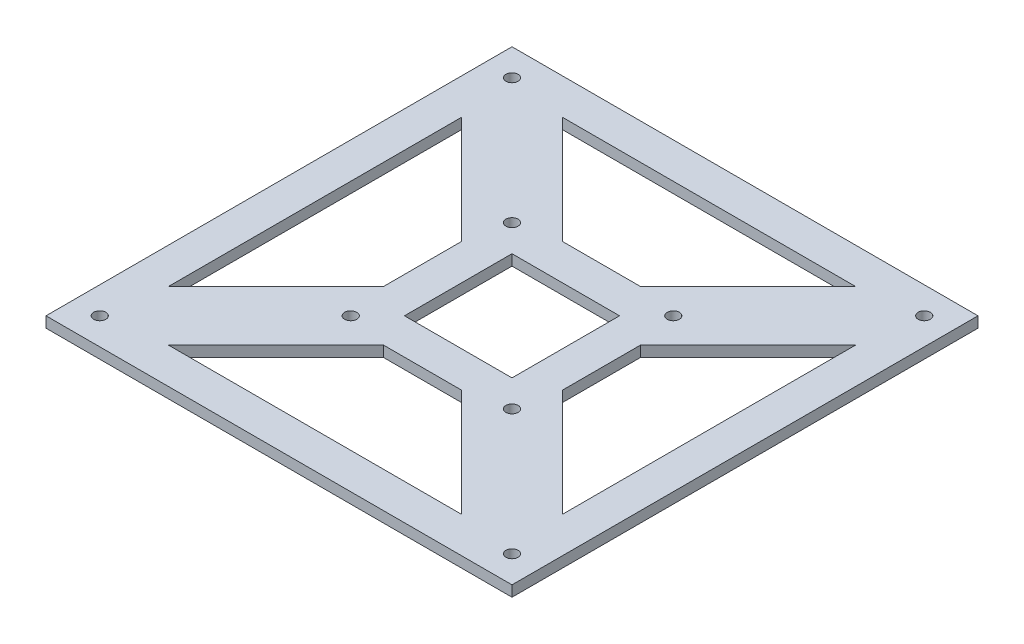
ISO-10303-21;
HEADER;
FILE_DESCRIPTION(('STEP AP214'),'2;1');
FILE_NAME('part.step','',(''),(''),'','','');
FILE_SCHEMA(('AUTOMOTIVE_DESIGN { 1 0 10303 214 1 1 1 1 }'));
ENDSEC;
DATA;
#1=APPLICATION_CONTEXT('core data for automotive mechanical design processes');
#2=APPLICATION_PROTOCOL_DEFINITION('international standard','automotive_design',2000,#1);
#3=PRODUCT_CONTEXT('',#1,'mechanical');
#4=PRODUCT('Part','Part','',(#3));
#5=PRODUCT_RELATED_PRODUCT_CATEGORY('part','',(#4));
#6=PRODUCT_DEFINITION_FORMATION('','',#4);
#7=PRODUCT_DEFINITION_CONTEXT('part definition',#1,'design');
#8=PRODUCT_DEFINITION('design','',#6,#7);
#9=PRODUCT_DEFINITION_SHAPE('','',#8);
#10=(LENGTH_UNIT() NAMED_UNIT(*) SI_UNIT(.MILLI.,.METRE.));
#11=(NAMED_UNIT(*) PLANE_ANGLE_UNIT() SI_UNIT($,.RADIAN.));
#12=(NAMED_UNIT(*) SI_UNIT($,.STERADIAN.) SOLID_ANGLE_UNIT());
#13=UNCERTAINTY_MEASURE_WITH_UNIT(LENGTH_MEASURE(1.E-05),#10,'distance_accuracy_value','');
#14=(GEOMETRIC_REPRESENTATION_CONTEXT(3) GLOBAL_UNCERTAINTY_ASSIGNED_CONTEXT((#13)) GLOBAL_UNIT_ASSIGNED_CONTEXT((#10,
#11,#12)) REPRESENTATION_CONTEXT('',''));
#15=CARTESIAN_POINT('',(0.,0.,0.));
#16=DIRECTION('',(0.,0.,1.));
#17=DIRECTION('',(1.,0.,0.));
#18=AXIS2_PLACEMENT_3D('',#15,#16,#17);
#19=CARTESIAN_POINT('',(0.,3.,-65.));
#20=DIRECTION('',(0.,0.,-1.));
#21=DIRECTION('',(-1.,0.,0.));
#22=AXIS2_PLACEMENT_3D('',#19,#20,#21);
#23=PLANE('',#22);
#24=DIRECTION('',(1.,0.,0.));
#25=VECTOR('',#24,1.);
#26=CARTESIAN_POINT('',(0.,0.,-65.));
#27=LINE('',#26,#25);
#28=CARTESIAN_POINT('',(-65.,0.,-65.));
#29=VERTEX_POINT('',#28);
#30=CARTESIAN_POINT('',(65.,0.,-65.));
#31=VERTEX_POINT('',#30);
#32=EDGE_CURVE('E383',#29,#31,#27,.T.);
#33=ORIENTED_EDGE('',*,*,#32,.F.);
#34=DIRECTION('',(0.,-1.,0.));
#35=VECTOR('',#34,1.);
#36=CARTESIAN_POINT('',(-65.,3.,-65.));
#37=LINE('',#36,#35);
#38=CARTESIAN_POINT('',(-65.,3.,-65.));
#39=VERTEX_POINT('',#38);
#40=EDGE_CURVE('E127',#39,#29,#37,.T.);
#41=ORIENTED_EDGE('',*,*,#40,.F.);
#42=DIRECTION('',(1.,0.,0.));
#43=VECTOR('',#42,1.);
#44=CARTESIAN_POINT('',(0.,3.,-65.));
#45=LINE('',#44,#43);
#46=CARTESIAN_POINT('',(65.,3.,-65.));
#47=VERTEX_POINT('',#46);
#48=EDGE_CURVE('E512',#39,#47,#45,.T.);
#49=ORIENTED_EDGE('',*,*,#48,.T.);
#50=DIRECTION('',(0.,-1.,0.));
#51=VECTOR('',#50,1.);
#52=CARTESIAN_POINT('',(65.,3.,-65.));
#53=LINE('',#52,#51);
#54=EDGE_CURVE('E12',#47,#31,#53,.T.);
#55=ORIENTED_EDGE('',*,*,#54,.T.);
#56=EDGE_LOOP('',(#33,#41,#49,#55));
#57=FACE_BOUND('',#56,.T.);
#58=ADVANCED_FACE('F116',(#57),#23,.T.);
#59=CARTESIAN_POINT('',(-65.,3.,0.));
#60=DIRECTION('',(1.,0.,0.));
#61=DIRECTION('',(0.,0.,-1.));
#62=AXIS2_PLACEMENT_3D('',#59,#60,#61);
#63=PLANE('',#62);
#64=DIRECTION('',(0.,0.,1.));
#65=VECTOR('',#64,1.);
#66=CARTESIAN_POINT('',(-65.,0.,0.));
#67=LINE('',#66,#65);
#68=CARTESIAN_POINT('',(-65.,0.,65.));
#69=VERTEX_POINT('',#68);
#70=EDGE_CURVE('E387',#29,#69,#67,.T.);
#71=ORIENTED_EDGE('',*,*,#70,.T.);
#72=DIRECTION('',(0.,-1.,0.));
#73=VECTOR('',#72,1.);
#74=CARTESIAN_POINT('',(-65.,3.,65.));
#75=LINE('',#74,#73);
#76=CARTESIAN_POINT('',(-65.,3.,65.));
#77=VERTEX_POINT('',#76);
#78=EDGE_CURVE('E399',#77,#69,#75,.T.);
#79=ORIENTED_EDGE('',*,*,#78,.F.);
#80=DIRECTION('',(0.,0.,1.));
#81=VECTOR('',#80,1.);
#82=CARTESIAN_POINT('',(-65.,3.,0.));
#83=LINE('',#82,#81);
#84=EDGE_CURVE('E515',#39,#77,#83,.T.);
#85=ORIENTED_EDGE('',*,*,#84,.F.);
#86=ORIENTED_EDGE('',*,*,#40,.T.);
#87=EDGE_LOOP('',(#71,#79,#85,#86));
#88=FACE_BOUND('',#87,.T.);
#89=ADVANCED_FACE('F522',(#88),#63,.F.);
#90=CARTESIAN_POINT('',(0.,3.,65.));
#91=DIRECTION('',(0.,0.,-1.));
#92=DIRECTION('',(-1.,0.,0.));
#93=AXIS2_PLACEMENT_3D('',#90,#91,#92);
#94=PLANE('',#93);
#95=DIRECTION('',(1.,0.,0.));
#96=VECTOR('',#95,1.);
#97=CARTESIAN_POINT('',(0.,0.,65.));
#98=LINE('',#97,#96);
#99=CARTESIAN_POINT('',(65.,0.,65.));
#100=VERTEX_POINT('',#99);
#101=EDGE_CURVE('E391',#69,#100,#98,.T.);
#102=ORIENTED_EDGE('',*,*,#101,.T.);
#103=DIRECTION('',(0.,-1.,0.));
#104=VECTOR('',#103,1.);
#105=CARTESIAN_POINT('',(65.,3.,65.));
#106=LINE('',#105,#104);
#107=CARTESIAN_POINT('',(65.,3.,65.));
#108=VERTEX_POINT('',#107);
#109=EDGE_CURVE('E396',#108,#100,#106,.T.);
#110=ORIENTED_EDGE('',*,*,#109,.F.);
#111=DIRECTION('',(1.,0.,0.));
#112=VECTOR('',#111,1.);
#113=CARTESIAN_POINT('',(0.,3.,65.));
#114=LINE('',#113,#112);
#115=EDGE_CURVE('E136',#77,#108,#114,.T.);
#116=ORIENTED_EDGE('',*,*,#115,.F.);
#117=ORIENTED_EDGE('',*,*,#78,.T.);
#118=EDGE_LOOP('',(#102,#110,#116,#117));
#119=FACE_BOUND('',#118,.T.);
#120=ADVANCED_FACE('F525',(#119),#94,.F.);
#121=CARTESIAN_POINT('',(65.,3.,0.));
#122=DIRECTION('',(1.,0.,0.));
#123=DIRECTION('',(0.,0.,-1.));
#124=AXIS2_PLACEMENT_3D('',#121,#122,#123);
#125=PLANE('',#124);
#126=DIRECTION('',(0.,0.,1.));
#127=VECTOR('',#126,1.);
#128=CARTESIAN_POINT('',(65.,0.,0.));
#129=LINE('',#128,#127);
#130=EDGE_CURVE('E379',#31,#100,#129,.T.);
#131=ORIENTED_EDGE('',*,*,#130,.F.);
#132=ORIENTED_EDGE('',*,*,#54,.F.);
#133=DIRECTION('',(0.,0.,1.));
#134=VECTOR('',#133,1.);
#135=CARTESIAN_POINT('',(65.,3.,0.));
#136=LINE('',#135,#134);
#137=EDGE_CURVE('E508',#47,#108,#136,.T.);
#138=ORIENTED_EDGE('',*,*,#137,.T.);
#139=ORIENTED_EDGE('',*,*,#109,.T.);
#140=EDGE_LOOP('',(#131,#132,#138,#139));
#141=FACE_BOUND('',#140,.T.);
#142=ADVANCED_FACE('F529',(#141),#125,.T.);
#143=CARTESIAN_POINT('',(-7.07106781186545,3.,-7.07106781186545));
#144=DIRECTION('',(-0.707106781186547,0.,-0.707106781186548));
#145=DIRECTION('',(-0.707106781186548,0.,0.707106781186547));
#146=AXIS2_PLACEMENT_3D('',#143,#144,#145);
#147=PLANE('',#146);
#148=DIRECTION('',(0.707106781186548,0.,-0.707106781186547));
#149=VECTOR('',#148,1.);
#150=CARTESIAN_POINT('',(-7.07106781186545,0.,-7.07106781186545));
#151=LINE('',#150,#149);
#152=CARTESIAN_POINT('',(-55.,0.,40.8578643762691));
#153=VERTEX_POINT('',#152);
#154=CARTESIAN_POINT('',(-25.,0.,10.8578643762691));
#155=VERTEX_POINT('',#154);
#156=EDGE_CURVE('E300',#153,#155,#151,.T.);
#157=ORIENTED_EDGE('',*,*,#156,.F.);
#158=DIRECTION('',(0.,-1.,0.));
#159=VECTOR('',#158,1.);
#160=CARTESIAN_POINT('',(-55.,3.,40.8578643762691));
#161=LINE('',#160,#159);
#162=CARTESIAN_POINT('',(-55.,3.,40.8578643762691));
#163=VERTEX_POINT('',#162);
#164=EDGE_CURVE('E448',#163,#153,#161,.T.);
#165=ORIENTED_EDGE('',*,*,#164,.F.);
#166=DIRECTION('',(0.707106781186548,0.,-0.707106781186547));
#167=VECTOR('',#166,1.);
#168=CARTESIAN_POINT('',(-7.07106781186545,3.,-7.07106781186545));
#169=LINE('',#168,#167);
#170=CARTESIAN_POINT('',(-25.,3.,10.8578643762691));
#171=VERTEX_POINT('',#170);
#172=EDGE_CURVE('E395',#163,#171,#169,.T.);
#173=ORIENTED_EDGE('',*,*,#172,.T.);
#174=DIRECTION('',(0.,-1.,0.));
#175=VECTOR('',#174,1.);
#176=CARTESIAN_POINT('',(-25.,3.,10.8578643762691));
#177=LINE('',#176,#175);
#178=EDGE_CURVE('E322',#171,#155,#177,.T.);
#179=ORIENTED_EDGE('',*,*,#178,.T.);
#180=EDGE_LOOP('',(#157,#165,#173,#179));
#181=FACE_BOUND('',#180,.T.);
#182=ADVANCED_FACE('F452',(#181),#147,.T.);
#183=CARTESIAN_POINT('',(-55.,3.,0.));
#184=DIRECTION('',(1.,0.,0.));
#185=DIRECTION('',(0.,0.,-1.));
#186=AXIS2_PLACEMENT_3D('',#183,#184,#185);
#187=PLANE('',#186);
#188=DIRECTION('',(0.,0.,1.));
#189=VECTOR('',#188,1.);
#190=CARTESIAN_POINT('',(-55.,0.,0.));
#191=LINE('',#190,#189);
#192=CARTESIAN_POINT('',(-55.,0.,-40.8578643762769));
#193=VERTEX_POINT('',#192);
#194=EDGE_CURVE('E333',#193,#153,#191,.T.);
#195=ORIENTED_EDGE('',*,*,#194,.F.);
#196=DIRECTION('',(0.,-1.,0.));
#197=VECTOR('',#196,1.);
#198=CARTESIAN_POINT('',(-55.,3.,-40.8578643762769));
#199=LINE('',#198,#197);
#200=CARTESIAN_POINT('',(-55.,3.,-40.8578643762769));
#201=VERTEX_POINT('',#200);
#202=EDGE_CURVE('E445',#201,#193,#199,.T.);
#203=ORIENTED_EDGE('',*,*,#202,.F.);
#204=DIRECTION('',(0.,0.,1.));
#205=VECTOR('',#204,1.);
#206=CARTESIAN_POINT('',(-55.,3.,0.));
#207=LINE('',#206,#205);
#208=EDGE_CURVE('E460',#201,#163,#207,.T.);
#209=ORIENTED_EDGE('',*,*,#208,.T.);
#210=ORIENTED_EDGE('',*,*,#164,.T.);
#211=EDGE_LOOP('',(#195,#203,#209,#210));
#212=FACE_BOUND('',#211,.T.);
#213=ADVANCED_FACE('F660',(#212),#187,.T.);
#214=CARTESIAN_POINT('',(-7.07106781186158,3.,7.07106781186158));
#215=DIRECTION('',(0.707106781186547,0.,-0.707106781186547));
#216=DIRECTION('',(-0.707106781186548,0.,-0.707106781186548));
#217=AXIS2_PLACEMENT_3D('',#214,#215,#216);
#218=PLANE('',#217);
#219=DIRECTION('',(0.707106781186548,0.,0.707106781186548));
#220=VECTOR('',#219,1.);
#221=CARTESIAN_POINT('',(-7.07106781186158,0.,7.07106781186158));
#222=LINE('',#221,#220);
#223=CARTESIAN_POINT('',(-25.,0.,-10.8578643762768));
#224=VERTEX_POINT('',#223);
#225=EDGE_CURVE('E339',#193,#224,#222,.T.);
#226=ORIENTED_EDGE('',*,*,#225,.T.);
#227=DIRECTION('',(0.,-1.,0.));
#228=VECTOR('',#227,1.);
#229=CARTESIAN_POINT('',(-25.,3.,-10.8578643762768));
#230=LINE('',#229,#228);
#231=CARTESIAN_POINT('',(-25.,3.,-10.8578643762768));
#232=VERTEX_POINT('',#231);
#233=EDGE_CURVE('E324',#232,#224,#230,.T.);
#234=ORIENTED_EDGE('',*,*,#233,.F.);
#235=DIRECTION('',(0.707106781186548,0.,0.707106781186548));
#236=VECTOR('',#235,1.);
#237=CARTESIAN_POINT('',(-7.07106781186158,3.,7.07106781186158));
#238=LINE('',#237,#236);
#239=EDGE_CURVE('E463',#201,#232,#238,.T.);
#240=ORIENTED_EDGE('',*,*,#239,.F.);
#241=ORIENTED_EDGE('',*,*,#202,.T.);
#242=EDGE_LOOP('',(#226,#234,#240,#241));
#243=FACE_BOUND('',#242,.T.);
#244=ADVANCED_FACE('F656',(#243),#218,.F.);
#245=CARTESIAN_POINT('',(7.07106781186937,3.,-7.07106781186937));
#246=DIRECTION('',(0.707106781186547,0.,-0.707106781186548));
#247=DIRECTION('',(-0.707106781186548,0.,-0.707106781186547));
#248=AXIS2_PLACEMENT_3D('',#245,#246,#247);
#249=PLANE('',#248);
#250=DIRECTION('',(0.707106781186548,0.,0.707106781186547));
#251=VECTOR('',#250,1.);
#252=CARTESIAN_POINT('',(7.07106781186937,0.,-7.07106781186937));
#253=LINE('',#252,#251);
#254=CARTESIAN_POINT('',(-40.8578643762613,0.,-55.));
#255=VERTEX_POINT('',#254);
#256=CARTESIAN_POINT('',(-10.8578643762612,0.,-25.));
#257=VERTEX_POINT('',#256);
#258=EDGE_CURVE('E346',#255,#257,#253,.T.);
#259=ORIENTED_EDGE('',*,*,#258,.F.);
#260=DIRECTION('',(0.,-1.,0.));
#261=VECTOR('',#260,1.);
#262=CARTESIAN_POINT('',(-40.8578643762613,3.,-55.));
#263=LINE('',#262,#261);
#264=CARTESIAN_POINT('',(-40.8578643762613,3.,-55.));
#265=VERTEX_POINT('',#264);
#266=EDGE_CURVE('E437',#265,#255,#263,.T.);
#267=ORIENTED_EDGE('',*,*,#266,.F.);
#268=DIRECTION('',(0.707106781186548,0.,0.707106781186547));
#269=VECTOR('',#268,1.);
#270=CARTESIAN_POINT('',(7.07106781186937,3.,-7.07106781186937));
#271=LINE('',#270,#269);
#272=CARTESIAN_POINT('',(-10.8578643762612,3.,-25.));
#273=VERTEX_POINT('',#272);
#274=EDGE_CURVE('E472',#265,#273,#271,.T.);
#275=ORIENTED_EDGE('',*,*,#274,.T.);
#276=DIRECTION('',(0.,-1.,0.));
#277=VECTOR('',#276,1.);
#278=CARTESIAN_POINT('',(-10.8578643762612,3.,-25.));
#279=LINE('',#278,#277);
#280=EDGE_CURVE('E440',#273,#257,#279,.T.);
#281=ORIENTED_EDGE('',*,*,#280,.T.);
#282=EDGE_LOOP('',(#259,#267,#275,#281));
#283=FACE_BOUND('',#282,.T.);
#284=ADVANCED_FACE('F652',(#283),#249,.T.);
#285=CARTESIAN_POINT('',(0.,3.,-55.));
#286=DIRECTION('',(0.,0.,-1.));
#287=DIRECTION('',(-1.,0.,0.));
#288=AXIS2_PLACEMENT_3D('',#285,#286,#287);
#289=PLANE('',#288);
#290=DIRECTION('',(1.,0.,0.));
#291=VECTOR('',#290,1.);
#292=CARTESIAN_POINT('',(0.,0.,-55.));
#293=LINE('',#292,#291);
#294=CARTESIAN_POINT('',(40.8578643762691,0.,-55.));
#295=VERTEX_POINT('',#294);
#296=EDGE_CURVE('E350',#255,#295,#293,.T.);
#297=ORIENTED_EDGE('',*,*,#296,.T.);
#298=DIRECTION('',(0.,-1.,0.));
#299=VECTOR('',#298,1.);
#300=CARTESIAN_POINT('',(40.8578643762691,3.,-55.));
#301=LINE('',#300,#299);
#302=CARTESIAN_POINT('',(40.8578643762691,3.,-55.));
#303=VERTEX_POINT('',#302);
#304=EDGE_CURVE('E433',#303,#295,#301,.T.);
#305=ORIENTED_EDGE('',*,*,#304,.F.);
#306=DIRECTION('',(1.,0.,0.));
#307=VECTOR('',#306,1.);
#308=CARTESIAN_POINT('',(0.,3.,-55.));
#309=LINE('',#308,#307);
#310=EDGE_CURVE('E476',#265,#303,#309,.T.);
#311=ORIENTED_EDGE('',*,*,#310,.F.);
#312=ORIENTED_EDGE('',*,*,#266,.T.);
#313=EDGE_LOOP('',(#297,#305,#311,#312));
#314=FACE_BOUND('',#313,.T.);
#315=ADVANCED_FACE('F648',(#314),#289,.F.);
#316=CARTESIAN_POINT('',(-7.07106781186544,3.,-7.07106781186544));
#317=DIRECTION('',(0.707106781186548,0.,0.707106781186547));
#318=DIRECTION('',(0.707106781186547,0.,-0.707106781186548));
#319=AXIS2_PLACEMENT_3D('',#316,#317,#318);
#320=PLANE('',#319);
#321=DIRECTION('',(-0.707106781186547,0.,0.707106781186548));
#322=VECTOR('',#321,1.);
#323=CARTESIAN_POINT('',(-7.07106781186544,0.,-7.07106781186544));
#324=LINE('',#323,#322);
#325=CARTESIAN_POINT('',(10.8578643762691,0.,-25.));
#326=VERTEX_POINT('',#325);
#327=EDGE_CURVE('E353',#295,#326,#324,.T.);
#328=ORIENTED_EDGE('',*,*,#327,.T.);
#329=DIRECTION('',(0.,-1.,0.));
#330=VECTOR('',#329,1.);
#331=CARTESIAN_POINT('',(10.8578643762691,3.,-25.));
#332=LINE('',#331,#330);
#333=CARTESIAN_POINT('',(10.8578643762691,3.,-25.));
#334=VERTEX_POINT('',#333);
#335=EDGE_CURVE('E430',#334,#326,#332,.T.);
#336=ORIENTED_EDGE('',*,*,#335,.F.);
#337=DIRECTION('',(-0.707106781186547,0.,0.707106781186548));
#338=VECTOR('',#337,1.);
#339=CARTESIAN_POINT('',(-7.07106781186544,3.,-7.07106781186544));
#340=LINE('',#339,#338);
#341=EDGE_CURVE('E480',#303,#334,#340,.T.);
#342=ORIENTED_EDGE('',*,*,#341,.F.);
#343=ORIENTED_EDGE('',*,*,#304,.T.);
#344=EDGE_LOOP('',(#328,#336,#342,#343));
#345=FACE_BOUND('',#344,.T.);
#346=ADVANCED_FACE('F645',(#345),#320,.F.);
#347=CARTESIAN_POINT('',(7.0710678118655,3.,7.0710678118655));
#348=DIRECTION('',(0.707106781186548,0.,0.707106781186547));
#349=DIRECTION('',(0.707106781186547,0.,-0.707106781186548));
#350=AXIS2_PLACEMENT_3D('',#347,#348,#349);
#351=PLANE('',#350);
#352=DIRECTION('',(-0.707106781186547,0.,0.707106781186548));
#353=VECTOR('',#352,1.);
#354=CARTESIAN_POINT('',(7.0710678118655,0.,7.0710678118655));
#355=LINE('',#354,#353);
#356=CARTESIAN_POINT('',(55.,0.,-40.857864376269));
#357=VERTEX_POINT('',#356);
#358=CARTESIAN_POINT('',(25.,0.,-10.857864376269));
#359=VERTEX_POINT('',#358);
#360=EDGE_CURVE('E357',#357,#359,#355,.T.);
#361=ORIENTED_EDGE('',*,*,#360,.F.);
#362=DIRECTION('',(0.,-1.,0.));
#363=VECTOR('',#362,1.);
#364=CARTESIAN_POINT('',(55.,3.,-40.857864376269));
#365=LINE('',#364,#363);
#366=CARTESIAN_POINT('',(55.,3.,-40.857864376269));
#367=VERTEX_POINT('',#366);
#368=EDGE_CURVE('E424',#367,#357,#365,.T.);
#369=ORIENTED_EDGE('',*,*,#368,.F.);
#370=DIRECTION('',(-0.707106781186547,0.,0.707106781186548));
#371=VECTOR('',#370,1.);
#372=CARTESIAN_POINT('',(7.0710678118655,3.,7.0710678118655));
#373=LINE('',#372,#371);
#374=CARTESIAN_POINT('',(25.,3.,-10.857864376269));
#375=VERTEX_POINT('',#374);
#376=EDGE_CURVE('E484',#367,#375,#373,.T.);
#377=ORIENTED_EDGE('',*,*,#376,.T.);
#378=DIRECTION('',(0.,-1.,0.));
#379=VECTOR('',#378,1.);
#380=CARTESIAN_POINT('',(25.,3.,-10.857864376269));
#381=LINE('',#380,#379);
#382=EDGE_CURVE('E427',#375,#359,#381,.T.);
#383=ORIENTED_EDGE('',*,*,#382,.T.);
#384=EDGE_LOOP('',(#361,#369,#377,#383));
#385=FACE_BOUND('',#384,.T.);
#386=ADVANCED_FACE('F589',(#385),#351,.T.);
#387=CARTESIAN_POINT('',(55.,3.,0.));
#388=DIRECTION('',(1.,0.,0.));
#389=DIRECTION('',(0.,0.,-1.));
#390=AXIS2_PLACEMENT_3D('',#387,#388,#389);
#391=PLANE('',#390);
#392=DIRECTION('',(0.,0.,1.));
#393=VECTOR('',#392,1.);
#394=CARTESIAN_POINT('',(55.,0.,0.));
#395=LINE('',#394,#393);
#396=CARTESIAN_POINT('',(55.,0.,40.8578643762613));
#397=VERTEX_POINT('',#396);
#398=EDGE_CURVE('E361',#357,#397,#395,.T.);
#399=ORIENTED_EDGE('',*,*,#398,.T.);
#400=DIRECTION('',(0.,-1.,0.));
#401=VECTOR('',#400,1.);
#402=CARTESIAN_POINT('',(55.,3.,40.8578643762613));
#403=LINE('',#402,#401);
#404=CARTESIAN_POINT('',(55.,3.,40.8578643762613));
#405=VERTEX_POINT('',#404);
#406=EDGE_CURVE('E420',#405,#397,#403,.T.);
#407=ORIENTED_EDGE('',*,*,#406,.F.);
#408=DIRECTION('',(0.,0.,1.));
#409=VECTOR('',#408,1.);
#410=CARTESIAN_POINT('',(55.,3.,0.));
#411=LINE('',#410,#409);
#412=EDGE_CURVE('E488',#367,#405,#411,.T.);
#413=ORIENTED_EDGE('',*,*,#412,.F.);
#414=ORIENTED_EDGE('',*,*,#368,.T.);
#415=EDGE_LOOP('',(#399,#407,#413,#414));
#416=FACE_BOUND('',#415,.T.);
#417=ADVANCED_FACE('F635',(#416),#391,.F.);
#418=CARTESIAN_POINT('',(7.07106781186935,3.,-7.07106781186935));
#419=DIRECTION('',(-0.707106781186547,0.,0.707106781186548));
#420=DIRECTION('',(0.707106781186548,0.,0.707106781186547));
#421=AXIS2_PLACEMENT_3D('',#418,#419,#420);
#422=PLANE('',#421);
#423=DIRECTION('',(-0.707106781186548,0.,-0.707106781186547));
#424=VECTOR('',#423,1.);
#425=CARTESIAN_POINT('',(7.07106781186935,0.,-7.07106781186935));
#426=LINE('',#425,#424);
#427=CARTESIAN_POINT('',(25.,0.,10.8578643762613));
#428=VERTEX_POINT('',#427);
#429=EDGE_CURVE('E364',#397,#428,#426,.T.);
#430=ORIENTED_EDGE('',*,*,#429,.T.);
#431=DIRECTION('',(0.,-1.,0.));
#432=VECTOR('',#431,1.);
#433=CARTESIAN_POINT('',(25.,3.,10.8578643762613));
#434=LINE('',#433,#432);
#435=CARTESIAN_POINT('',(25.,3.,10.8578643762613));
#436=VERTEX_POINT('',#435);
#437=EDGE_CURVE('E417',#436,#428,#434,.T.);
#438=ORIENTED_EDGE('',*,*,#437,.F.);
#439=DIRECTION('',(-0.707106781186548,0.,-0.707106781186547));
#440=VECTOR('',#439,1.);
#441=CARTESIAN_POINT('',(7.07106781186935,3.,-7.07106781186935));
#442=LINE('',#441,#440);
#443=EDGE_CURVE('E492',#405,#436,#442,.T.);
#444=ORIENTED_EDGE('',*,*,#443,.F.);
#445=ORIENTED_EDGE('',*,*,#406,.T.);
#446=EDGE_LOOP('',(#430,#438,#444,#445));
#447=FACE_BOUND('',#446,.T.);
#448=ADVANCED_FACE('F628',(#447),#422,.F.);
#449=CARTESIAN_POINT('',(-7.0710678118616,3.,7.07106781186161));
#450=DIRECTION('',(-0.707106781186547,0.,0.707106781186548));
#451=DIRECTION('',(0.707106781186548,0.,0.707106781186547));
#452=AXIS2_PLACEMENT_3D('',#449,#450,#451);
#453=PLANE('',#452);
#454=DIRECTION('',(-0.707106781186548,0.,-0.707106781186547));
#455=VECTOR('',#454,1.);
#456=CARTESIAN_POINT('',(-7.0710678118616,0.,7.07106781186161));
#457=LINE('',#456,#455);
#458=CARTESIAN_POINT('',(40.8578643762768,0.,55.));
#459=VERTEX_POINT('',#458);
#460=CARTESIAN_POINT('',(10.8578643762768,0.,25.));
#461=VERTEX_POINT('',#460);
#462=EDGE_CURVE('E368',#459,#461,#457,.T.);
#463=ORIENTED_EDGE('',*,*,#462,.F.);
#464=DIRECTION('',(0.,-1.,0.));
#465=VECTOR('',#464,1.);
#466=CARTESIAN_POINT('',(40.8578643762768,3.,55.));
#467=LINE('',#466,#465);
#468=CARTESIAN_POINT('',(40.8578643762768,3.,55.));
#469=VERTEX_POINT('',#468);
#470=EDGE_CURVE('E411',#469,#459,#467,.T.);
#471=ORIENTED_EDGE('',*,*,#470,.F.);
#472=DIRECTION('',(-0.707106781186548,0.,-0.707106781186547));
#473=VECTOR('',#472,1.);
#474=CARTESIAN_POINT('',(-7.0710678118616,3.,7.07106781186161));
#475=LINE('',#474,#473);
#476=CARTESIAN_POINT('',(10.8578643762768,3.,25.));
#477=VERTEX_POINT('',#476);
#478=EDGE_CURVE('E496',#469,#477,#475,.T.);
#479=ORIENTED_EDGE('',*,*,#478,.T.);
#480=DIRECTION('',(0.,-1.,0.));
#481=VECTOR('',#480,1.);
#482=CARTESIAN_POINT('',(10.8578643762768,3.,25.));
#483=LINE('',#482,#481);
#484=EDGE_CURVE('E414',#477,#461,#483,.T.);
#485=ORIENTED_EDGE('',*,*,#484,.T.);
#486=EDGE_LOOP('',(#463,#471,#479,#485));
#487=FACE_BOUND('',#486,.T.);
#488=ADVANCED_FACE('F626',(#487),#453,.T.);
#489=CARTESIAN_POINT('',(0.,3.,55.));
#490=DIRECTION('',(0.,0.,-1.));
#491=DIRECTION('',(-1.,0.,0.));
#492=AXIS2_PLACEMENT_3D('',#489,#490,#491);
#493=PLANE('',#492);
#494=DIRECTION('',(1.,0.,0.));
#495=VECTOR('',#494,1.);
#496=CARTESIAN_POINT('',(0.,0.,55.));
#497=LINE('',#496,#495);
#498=CARTESIAN_POINT('',(-40.857864376269,0.,55.));
#499=VERTEX_POINT('',#498);
#500=EDGE_CURVE('E371',#499,#459,#497,.T.);
#501=ORIENTED_EDGE('',*,*,#500,.F.);
#502=DIRECTION('',(0.,-1.,0.));
#503=VECTOR('',#502,1.);
#504=CARTESIAN_POINT('',(-40.857864376269,3.,55.));
#505=LINE('',#504,#503);
#506=CARTESIAN_POINT('',(-40.857864376269,3.,55.));
#507=VERTEX_POINT('',#506);
#508=EDGE_CURVE('E408',#507,#499,#505,.T.);
#509=ORIENTED_EDGE('',*,*,#508,.F.);
#510=DIRECTION('',(1.,0.,0.));
#511=VECTOR('',#510,1.);
#512=CARTESIAN_POINT('',(0.,3.,55.));
#513=LINE('',#512,#511);
#514=EDGE_CURVE('E500',#507,#469,#513,.T.);
#515=ORIENTED_EDGE('',*,*,#514,.T.);
#516=ORIENTED_EDGE('',*,*,#470,.T.);
#517=EDGE_LOOP('',(#501,#509,#515,#516));
#518=FACE_BOUND('',#517,.T.);
#519=ADVANCED_FACE('F622',(#518),#493,.T.);
#520=CARTESIAN_POINT('',(7.07106781186548,3.,7.07106781186548));
#521=DIRECTION('',(-0.707106781186548,0.,-0.707106781186547));
#522=DIRECTION('',(-0.707106781186547,0.,0.707106781186548));
#523=AXIS2_PLACEMENT_3D('',#520,#521,#522);
#524=PLANE('',#523);
#525=DIRECTION('',(0.707106781186547,0.,-0.707106781186548));
#526=VECTOR('',#525,1.);
#527=CARTESIAN_POINT('',(7.07106781186548,0.,7.07106781186548));
#528=LINE('',#527,#526);
#529=CARTESIAN_POINT('',(-10.8578643762691,0.,25.));
#530=VERTEX_POINT('',#529);
#531=EDGE_CURVE('E375',#499,#530,#528,.T.);
#532=ORIENTED_EDGE('',*,*,#531,.T.);
#533=DIRECTION('',(0.,-1.,0.));
#534=VECTOR('',#533,1.);
#535=CARTESIAN_POINT('',(-10.8578643762691,3.,25.));
#536=LINE('',#535,#534);
#537=CARTESIAN_POINT('',(-10.8578643762691,3.,25.));
#538=VERTEX_POINT('',#537);
#539=EDGE_CURVE('E405',#538,#530,#536,.T.);
#540=ORIENTED_EDGE('',*,*,#539,.F.);
#541=DIRECTION('',(0.707106781186547,0.,-0.707106781186548));
#542=VECTOR('',#541,1.);
#543=CARTESIAN_POINT('',(7.07106781186548,3.,7.07106781186548));
#544=LINE('',#543,#542);
#545=EDGE_CURVE('E504',#507,#538,#544,.T.);
#546=ORIENTED_EDGE('',*,*,#545,.F.);
#547=ORIENTED_EDGE('',*,*,#508,.T.);
#548=EDGE_LOOP('',(#532,#540,#546,#547));
#549=FACE_BOUND('',#548,.T.);
#550=ADVANCED_FACE('F539',(#549),#524,.F.);
#551=CARTESIAN_POINT('',(0.,0.,0.));
#552=DIRECTION('',(0.,1.,0.));
#553=DIRECTION('',(0.,0.,1.));
#554=AXIS2_PLACEMENT_3D('',#551,#552,#553);
#555=PLANE('',#554);
#556=CARTESIAN_POINT('',(-22.5,0.,-22.5));
#557=DIRECTION('',(0.,1.,0.));
#558=DIRECTION('',(0.,0.,1.));
#559=AXIS2_PLACEMENT_3D('',#556,#557,#558);
#560=CIRCLE('',#559,1.7);
#561=CARTESIAN_POINT('',(-22.5,0.,-20.8));
#562=VERTEX_POINT('',#561);
#563=EDGE_CURVE('E999',#562,#562,#560,.T.);
#564=ORIENTED_EDGE('',*,*,#563,.T.);
#565=EDGE_LOOP('',(#564));
#566=FACE_BOUND('',#565,.T.);
#567=CARTESIAN_POINT('',(22.5,0.,22.5));
#568=DIRECTION('',(0.,1.,0.));
#569=DIRECTION('',(0.,0.,1.));
#570=AXIS2_PLACEMENT_3D('',#567,#568,#569);
#571=CIRCLE('',#570,1.7);
#572=CARTESIAN_POINT('',(22.5,0.,24.2));
#573=VERTEX_POINT('',#572);
#574=EDGE_CURVE('E1004',#573,#573,#571,.T.);
#575=ORIENTED_EDGE('',*,*,#574,.T.);
#576=EDGE_LOOP('',(#575));
#577=FACE_BOUND('',#576,.T.);
#578=CARTESIAN_POINT('',(22.5,0.,-22.5));
#579=DIRECTION('',(0.,1.,0.));
#580=DIRECTION('',(0.,0.,1.));
#581=AXIS2_PLACEMENT_3D('',#578,#579,#580);
#582=CIRCLE('',#581,1.7);
#583=CARTESIAN_POINT('',(22.5,0.,-20.8));
#584=VERTEX_POINT('',#583);
#585=EDGE_CURVE('E1018',#584,#584,#582,.T.);
#586=ORIENTED_EDGE('',*,*,#585,.T.);
#587=EDGE_LOOP('',(#586));
#588=FACE_BOUND('',#587,.T.);
#589=CARTESIAN_POINT('',(-22.5,0.,22.5));
#590=DIRECTION('',(0.,1.,0.));
#591=DIRECTION('',(0.,0.,1.));
#592=AXIS2_PLACEMENT_3D('',#589,#590,#591);
#593=CIRCLE('',#592,1.7);
#594=CARTESIAN_POINT('',(-22.5,0.,24.2));
#595=VERTEX_POINT('',#594);
#596=EDGE_CURVE('E1019',#595,#595,#593,.T.);
#597=ORIENTED_EDGE('',*,*,#596,.T.);
#598=EDGE_LOOP('',(#597));
#599=FACE_BOUND('',#598,.T.);
#600=CARTESIAN_POINT('',(57.5,0.,-57.5));
#601=DIRECTION('',(0.,1.,0.));
#602=DIRECTION('',(0.,0.,1.));
#603=AXIS2_PLACEMENT_3D('',#600,#601,#602);
#604=CIRCLE('',#603,1.7);
#605=CARTESIAN_POINT('',(57.5,0.,-55.8));
#606=VERTEX_POINT('',#605);
#607=EDGE_CURVE('E1043',#606,#606,#604,.T.);
#608=ORIENTED_EDGE('',*,*,#607,.T.);
#609=EDGE_LOOP('',(#608));
#610=FACE_BOUND('',#609,.T.);
#611=CARTESIAN_POINT('',(57.5,0.,57.5));
#612=DIRECTION('',(0.,1.,0.));
#613=DIRECTION('',(0.,0.,1.));
#614=AXIS2_PLACEMENT_3D('',#611,#612,#613);
#615=CIRCLE('',#614,1.7);
#616=CARTESIAN_POINT('',(57.5,0.,59.2));
#617=VERTEX_POINT('',#616);
#618=EDGE_CURVE('E1035',#617,#617,#615,.T.);
#619=ORIENTED_EDGE('',*,*,#618,.T.);
#620=EDGE_LOOP('',(#619));
#621=FACE_BOUND('',#620,.T.);
#622=CARTESIAN_POINT('',(-57.5,0.,57.5));
#623=DIRECTION('',(0.,1.,0.));
#624=DIRECTION('',(0.,0.,1.));
#625=AXIS2_PLACEMENT_3D('',#622,#623,#624);
#626=CIRCLE('',#625,1.7);
#627=CARTESIAN_POINT('',(-57.5,0.,59.2));
#628=VERTEX_POINT('',#627);
#629=EDGE_CURVE('E1027',#628,#628,#626,.T.);
#630=ORIENTED_EDGE('',*,*,#629,.T.);
#631=EDGE_LOOP('',(#630));
#632=FACE_BOUND('',#631,.T.);
#633=CARTESIAN_POINT('',(-57.5,0.,-57.5));
#634=DIRECTION('',(0.,1.,0.));
#635=DIRECTION('',(0.,0.,1.));
#636=AXIS2_PLACEMENT_3D('',#633,#634,#635);
#637=CIRCLE('',#636,1.7);
#638=CARTESIAN_POINT('',(-57.5,0.,-55.8));
#639=VERTEX_POINT('',#638);
#640=EDGE_CURVE('E267',#639,#639,#637,.T.);
#641=ORIENTED_EDGE('',*,*,#640,.T.);
#642=EDGE_LOOP('',(#641));
#643=FACE_BOUND('',#642,.T.);
#644=DIRECTION('',(1.,0.,0.));
#645=VECTOR('',#644,1.);
#646=CARTESIAN_POINT('',(-25.,0.,25.));
#647=LINE('',#646,#645);
#648=EDGE_CURVE('E307',#530,#461,#647,.T.);
#649=ORIENTED_EDGE('',*,*,#648,.F.);
#650=ORIENTED_EDGE('',*,*,#531,.F.);
#651=ORIENTED_EDGE('',*,*,#500,.T.);
#652=ORIENTED_EDGE('',*,*,#462,.T.);
#653=EDGE_LOOP('',(#649,#650,#651,#652));
#654=FACE_BOUND('',#653,.T.);
#655=DIRECTION('',(0.,0.,1.));
#656=VECTOR('',#655,1.);
#657=CARTESIAN_POINT('',(-25.,0.,-25.));
#658=LINE('',#657,#656);
#659=EDGE_CURVE('E120',#224,#155,#658,.T.);
#660=ORIENTED_EDGE('',*,*,#659,.F.);
#661=ORIENTED_EDGE('',*,*,#225,.F.);
#662=ORIENTED_EDGE('',*,*,#194,.T.);
#663=ORIENTED_EDGE('',*,*,#156,.T.);
#664=EDGE_LOOP('',(#660,#661,#662,#663));
#665=FACE_BOUND('',#664,.T.);
#666=ORIENTED_EDGE('',*,*,#258,.T.);
#667=DIRECTION('',(1.,0.,0.));
#668=VECTOR('',#667,1.);
#669=CARTESIAN_POINT('',(-25.,0.,-25.));
#670=LINE('',#669,#668);
#671=EDGE_CURVE('E279',#257,#326,#670,.T.);
#672=ORIENTED_EDGE('',*,*,#671,.T.);
#673=ORIENTED_EDGE('',*,*,#327,.F.);
#674=ORIENTED_EDGE('',*,*,#296,.F.);
#675=EDGE_LOOP('',(#666,#672,#673,#674));
#676=FACE_BOUND('',#675,.T.);
#677=ORIENTED_EDGE('',*,*,#360,.T.);
#678=DIRECTION('',(0.,0.,1.));
#679=VECTOR('',#678,1.);
#680=CARTESIAN_POINT('',(25.,0.,-25.));
#681=LINE('',#680,#679);
#682=EDGE_CURVE('E304',#359,#428,#681,.T.);
#683=ORIENTED_EDGE('',*,*,#682,.T.);
#684=ORIENTED_EDGE('',*,*,#429,.F.);
#685=ORIENTED_EDGE('',*,*,#398,.F.);
#686=EDGE_LOOP('',(#677,#683,#684,#685));
#687=FACE_BOUND('',#686,.T.);
#688=ORIENTED_EDGE('',*,*,#130,.T.);
#689=ORIENTED_EDGE('',*,*,#101,.F.);
#690=ORIENTED_EDGE('',*,*,#70,.F.);
#691=ORIENTED_EDGE('',*,*,#32,.T.);
#692=EDGE_LOOP('',(#688,#689,#690,#691));
#693=FACE_BOUND('',#692,.T.);
#694=DIRECTION('',(1.,0.,0.));
#695=VECTOR('',#694,1.);
#696=CARTESIAN_POINT('',(-15.,0.,-15.));
#697=LINE('',#696,#695);
#698=CARTESIAN_POINT('',(-15.,0.,-15.));
#699=VERTEX_POINT('',#698);
#700=CARTESIAN_POINT('',(15.,0.,-15.));
#701=VERTEX_POINT('',#700);
#702=EDGE_CURVE('E223',#699,#701,#697,.T.);
#703=ORIENTED_EDGE('',*,*,#702,.F.);
#704=DIRECTION('',(0.,0.,1.));
#705=VECTOR('',#704,1.);
#706=CARTESIAN_POINT('',(-15.,0.,-15.));
#707=LINE('',#706,#705);
#708=CARTESIAN_POINT('',(-15.,0.,15.));
#709=VERTEX_POINT('',#708);
#710=EDGE_CURVE('E259',#699,#709,#707,.T.);
#711=ORIENTED_EDGE('',*,*,#710,.T.);
#712=DIRECTION('',(1.,0.,0.));
#713=VECTOR('',#712,1.);
#714=CARTESIAN_POINT('',(-15.,0.,15.));
#715=LINE('',#714,#713);
#716=CARTESIAN_POINT('',(15.,0.,15.));
#717=VERTEX_POINT('',#716);
#718=EDGE_CURVE('E270',#709,#717,#715,.T.);
#719=ORIENTED_EDGE('',*,*,#718,.T.);
#720=DIRECTION('',(0.,0.,1.));
#721=VECTOR('',#720,1.);
#722=CARTESIAN_POINT('',(15.,0.,-15.));
#723=LINE('',#722,#721);
#724=EDGE_CURVE('E236',#701,#717,#723,.T.);
#725=ORIENTED_EDGE('',*,*,#724,.F.);
#726=EDGE_LOOP('',(#703,#711,#719,#725));
#727=FACE_BOUND('',#726,.T.);
#728=ADVANCED_FACE('F330',(#566,#577,#588,#599,#610,#621,#632,#643,#654,#665,#676,#687,#693,
#727),#555,.F.);
#729=CARTESIAN_POINT('',(0.,3.,0.));
#730=DIRECTION('',(0.,1.,0.));
#731=DIRECTION('',(0.,0.,1.));
#732=AXIS2_PLACEMENT_3D('',#729,#730,#731);
#733=PLANE('',#732);
#734=CARTESIAN_POINT('',(-22.5,3.,-22.5));
#735=DIRECTION('',(0.,1.,0.));
#736=DIRECTION('',(0.,0.,1.));
#737=AXIS2_PLACEMENT_3D('',#734,#735,#736);
#738=CIRCLE('',#737,1.7);
#739=CARTESIAN_POINT('',(-22.5,3.,-20.8));
#740=VERTEX_POINT('',#739);
#741=EDGE_CURVE('E1002',#740,#740,#738,.T.);
#742=ORIENTED_EDGE('',*,*,#741,.F.);
#743=EDGE_LOOP('',(#742));
#744=FACE_BOUND('',#743,.T.);
#745=CARTESIAN_POINT('',(22.5,3.,22.5));
#746=DIRECTION('',(0.,1.,0.));
#747=DIRECTION('',(0.,0.,1.));
#748=AXIS2_PLACEMENT_3D('',#745,#746,#747);
#749=CIRCLE('',#748,1.7);
#750=CARTESIAN_POINT('',(22.5,3.,24.2));
#751=VERTEX_POINT('',#750);
#752=EDGE_CURVE('E1011',#751,#751,#749,.T.);
#753=ORIENTED_EDGE('',*,*,#752,.F.);
#754=EDGE_LOOP('',(#753));
#755=FACE_BOUND('',#754,.T.);
#756=CARTESIAN_POINT('',(22.5,3.,-22.5));
#757=DIRECTION('',(0.,1.,0.));
#758=DIRECTION('',(0.,0.,1.));
#759=AXIS2_PLACEMENT_3D('',#756,#757,#758);
#760=CIRCLE('',#759,1.7);
#761=CARTESIAN_POINT('',(22.5,3.,-20.8));
#762=VERTEX_POINT('',#761);
#763=EDGE_CURVE('E1082',#762,#762,#760,.T.);
#764=ORIENTED_EDGE('',*,*,#763,.F.);
#765=EDGE_LOOP('',(#764));
#766=FACE_BOUND('',#765,.T.);
#767=CARTESIAN_POINT('',(-22.5,3.,22.5));
#768=DIRECTION('',(0.,1.,0.));
#769=DIRECTION('',(0.,0.,1.));
#770=AXIS2_PLACEMENT_3D('',#767,#768,#769);
#771=CIRCLE('',#770,1.7);
#772=CARTESIAN_POINT('',(-22.5,3.,24.2));
#773=VERTEX_POINT('',#772);
#774=EDGE_CURVE('E1008',#773,#773,#771,.T.);
#775=ORIENTED_EDGE('',*,*,#774,.F.);
#776=EDGE_LOOP('',(#775));
#777=FACE_BOUND('',#776,.T.);
#778=CARTESIAN_POINT('',(57.5,3.,-57.5));
#779=DIRECTION('',(0.,1.,0.));
#780=DIRECTION('',(0.,0.,1.));
#781=AXIS2_PLACEMENT_3D('',#778,#779,#780);
#782=CIRCLE('',#781,1.7);
#783=CARTESIAN_POINT('',(57.5,3.,-55.8));
#784=VERTEX_POINT('',#783);
#785=EDGE_CURVE('E1023',#784,#784,#782,.T.);
#786=ORIENTED_EDGE('',*,*,#785,.F.);
#787=EDGE_LOOP('',(#786));
#788=FACE_BOUND('',#787,.T.);
#789=CARTESIAN_POINT('',(57.5,3.,57.5));
#790=DIRECTION('',(0.,1.,0.));
#791=DIRECTION('',(0.,0.,1.));
#792=AXIS2_PLACEMENT_3D('',#789,#790,#791);
#793=CIRCLE('',#792,1.7);
#794=CARTESIAN_POINT('',(57.5,3.,59.2));
#795=VERTEX_POINT('',#794);
#796=EDGE_CURVE('E1039',#795,#795,#793,.T.);
#797=ORIENTED_EDGE('',*,*,#796,.F.);
#798=EDGE_LOOP('',(#797));
#799=FACE_BOUND('',#798,.T.);
#800=CARTESIAN_POINT('',(-57.5,3.,57.5));
#801=DIRECTION('',(0.,1.,0.));
#802=DIRECTION('',(0.,0.,1.));
#803=AXIS2_PLACEMENT_3D('',#800,#801,#802);
#804=CIRCLE('',#803,1.7);
#805=CARTESIAN_POINT('',(-57.5,3.,59.2));
#806=VERTEX_POINT('',#805);
#807=EDGE_CURVE('E1031',#806,#806,#804,.T.);
#808=ORIENTED_EDGE('',*,*,#807,.F.);
#809=EDGE_LOOP('',(#808));
#810=FACE_BOUND('',#809,.T.);
#811=CARTESIAN_POINT('',(-57.5,3.,-57.5));
#812=DIRECTION('',(0.,1.,0.));
#813=DIRECTION('',(0.,0.,1.));
#814=AXIS2_PLACEMENT_3D('',#811,#812,#813);
#815=CIRCLE('',#814,1.7);
#816=CARTESIAN_POINT('',(-57.5,3.,-55.8));
#817=VERTEX_POINT('',#816);
#818=EDGE_CURVE('E466',#817,#817,#815,.T.);
#819=ORIENTED_EDGE('',*,*,#818,.F.);
#820=EDGE_LOOP('',(#819));
#821=FACE_BOUND('',#820,.T.);
#822=ORIENTED_EDGE('',*,*,#545,.T.);
#823=DIRECTION('',(1.,0.,0.));
#824=VECTOR('',#823,1.);
#825=CARTESIAN_POINT('',(-25.,3.,25.));
#826=LINE('',#825,#824);
#827=EDGE_CURVE('E292',#538,#477,#826,.T.);
#828=ORIENTED_EDGE('',*,*,#827,.T.);
#829=ORIENTED_EDGE('',*,*,#478,.F.);
#830=ORIENTED_EDGE('',*,*,#514,.F.);
#831=EDGE_LOOP('',(#822,#828,#829,#830));
#832=FACE_BOUND('',#831,.T.);
#833=ORIENTED_EDGE('',*,*,#239,.T.);
#834=DIRECTION('',(0.,0.,1.));
#835=VECTOR('',#834,1.);
#836=CARTESIAN_POINT('',(-25.,3.,-25.));
#837=LINE('',#836,#835);
#838=EDGE_CURVE('E296',#232,#171,#837,.T.);
#839=ORIENTED_EDGE('',*,*,#838,.T.);
#840=ORIENTED_EDGE('',*,*,#172,.F.);
#841=ORIENTED_EDGE('',*,*,#208,.F.);
#842=EDGE_LOOP('',(#833,#839,#840,#841));
#843=FACE_BOUND('',#842,.T.);
#844=DIRECTION('',(1.,0.,0.));
#845=VECTOR('',#844,1.);
#846=CARTESIAN_POINT('',(-25.,3.,-25.));
#847=LINE('',#846,#845);
#848=EDGE_CURVE('E284',#273,#334,#847,.T.);
#849=ORIENTED_EDGE('',*,*,#848,.F.);
#850=ORIENTED_EDGE('',*,*,#274,.F.);
#851=ORIENTED_EDGE('',*,*,#310,.T.);
#852=ORIENTED_EDGE('',*,*,#341,.T.);
#853=EDGE_LOOP('',(#849,#850,#851,#852));
#854=FACE_BOUND('',#853,.T.);
#855=DIRECTION('',(0.,0.,1.));
#856=VECTOR('',#855,1.);
#857=CARTESIAN_POINT('',(25.,3.,-25.));
#858=LINE('',#857,#856);
#859=EDGE_CURVE('E288',#375,#436,#858,.T.);
#860=ORIENTED_EDGE('',*,*,#859,.F.);
#861=ORIENTED_EDGE('',*,*,#376,.F.);
#862=ORIENTED_EDGE('',*,*,#412,.T.);
#863=ORIENTED_EDGE('',*,*,#443,.T.);
#864=EDGE_LOOP('',(#860,#861,#862,#863));
#865=FACE_BOUND('',#864,.T.);
#866=ORIENTED_EDGE('',*,*,#137,.F.);
#867=ORIENTED_EDGE('',*,*,#48,.F.);
#868=ORIENTED_EDGE('',*,*,#84,.T.);
#869=ORIENTED_EDGE('',*,*,#115,.T.);
#870=EDGE_LOOP('',(#866,#867,#868,#869));
#871=FACE_BOUND('',#870,.T.);
#872=DIRECTION('',(0.,0.,1.));
#873=VECTOR('',#872,1.);
#874=CARTESIAN_POINT('',(-15.,3.,-15.));
#875=LINE('',#874,#873);
#876=CARTESIAN_POINT('',(-15.,3.,-15.));
#877=VERTEX_POINT('',#876);
#878=CARTESIAN_POINT('',(-15.,3.,15.));
#879=VERTEX_POINT('',#878);
#880=EDGE_CURVE('E251',#877,#879,#875,.T.);
#881=ORIENTED_EDGE('',*,*,#880,.F.);
#882=DIRECTION('',(1.,0.,0.));
#883=VECTOR('',#882,1.);
#884=CARTESIAN_POINT('',(-15.,3.,-15.));
#885=LINE('',#884,#883);
#886=CARTESIAN_POINT('',(15.,3.,-15.));
#887=VERTEX_POINT('',#886);
#888=EDGE_CURVE('E255',#877,#887,#885,.T.);
#889=ORIENTED_EDGE('',*,*,#888,.T.);
#890=DIRECTION('',(0.,0.,1.));
#891=VECTOR('',#890,1.);
#892=CARTESIAN_POINT('',(15.,3.,-15.));
#893=LINE('',#892,#891);
#894=CARTESIAN_POINT('',(15.,3.,15.));
#895=VERTEX_POINT('',#894);
#896=EDGE_CURVE('E233',#887,#895,#893,.T.);
#897=ORIENTED_EDGE('',*,*,#896,.T.);
#898=DIRECTION('',(1.,0.,0.));
#899=VECTOR('',#898,1.);
#900=CARTESIAN_POINT('',(-15.,3.,15.));
#901=LINE('',#900,#899);
#902=EDGE_CURVE('E246',#879,#895,#901,.T.);
#903=ORIENTED_EDGE('',*,*,#902,.F.);
#904=EDGE_LOOP('',(#881,#889,#897,#903));
#905=FACE_BOUND('',#904,.T.);
#906=ADVANCED_FACE('F253',(#744,#755,#766,#777,#788,#799,#810,#821,#832,#843,#854,#865,#871,
#905),#733,.T.);
#907=CARTESIAN_POINT('',(-25.,3.,-25.));
#908=DIRECTION('',(1.,0.,0.));
#909=DIRECTION('',(0.,0.,-1.));
#910=AXIS2_PLACEMENT_3D('',#907,#908,#909);
#911=PLANE('',#910);
#912=ORIENTED_EDGE('',*,*,#178,.F.);
#913=ORIENTED_EDGE('',*,*,#838,.F.);
#914=ORIENTED_EDGE('',*,*,#233,.T.);
#915=ORIENTED_EDGE('',*,*,#659,.T.);
#916=EDGE_LOOP('',(#912,#913,#914,#915));
#917=FACE_BOUND('',#916,.T.);
#918=ADVANCED_FACE('F320',(#917),#911,.F.);
#919=CARTESIAN_POINT('',(-25.,3.,25.));
#920=DIRECTION('',(0.,0.,-1.));
#921=DIRECTION('',(-1.,0.,0.));
#922=AXIS2_PLACEMENT_3D('',#919,#920,#921);
#923=PLANE('',#922);
#924=ORIENTED_EDGE('',*,*,#484,.F.);
#925=ORIENTED_EDGE('',*,*,#827,.F.);
#926=ORIENTED_EDGE('',*,*,#539,.T.);
#927=ORIENTED_EDGE('',*,*,#648,.T.);
#928=EDGE_LOOP('',(#924,#925,#926,#927));
#929=FACE_BOUND('',#928,.T.);
#930=ADVANCED_FACE('F562',(#929),#923,.F.);
#931=CARTESIAN_POINT('',(25.,3.,-25.));
#932=DIRECTION('',(1.,0.,0.));
#933=DIRECTION('',(0.,0.,-1.));
#934=AXIS2_PLACEMENT_3D('',#931,#932,#933);
#935=PLANE('',#934);
#936=ORIENTED_EDGE('',*,*,#682,.F.);
#937=ORIENTED_EDGE('',*,*,#382,.F.);
#938=ORIENTED_EDGE('',*,*,#859,.T.);
#939=ORIENTED_EDGE('',*,*,#437,.T.);
#940=EDGE_LOOP('',(#936,#937,#938,#939));
#941=FACE_BOUND('',#940,.T.);
#942=ADVANCED_FACE('F567',(#941),#935,.T.);
#943=CARTESIAN_POINT('',(-25.,3.,-25.));
#944=DIRECTION('',(0.,0.,-1.));
#945=DIRECTION('',(-1.,0.,0.));
#946=AXIS2_PLACEMENT_3D('',#943,#944,#945);
#947=PLANE('',#946);
#948=ORIENTED_EDGE('',*,*,#671,.F.);
#949=ORIENTED_EDGE('',*,*,#280,.F.);
#950=ORIENTED_EDGE('',*,*,#848,.T.);
#951=ORIENTED_EDGE('',*,*,#335,.T.);
#952=EDGE_LOOP('',(#948,#949,#950,#951));
#953=FACE_BOUND('',#952,.T.);
#954=ADVANCED_FACE('F118',(#953),#947,.T.);
#955=CARTESIAN_POINT('',(15.,3.,-15.));
#956=DIRECTION('',(1.,0.,0.));
#957=DIRECTION('',(0.,0.,-1.));
#958=AXIS2_PLACEMENT_3D('',#955,#956,#957);
#959=PLANE('',#958);
#960=ORIENTED_EDGE('',*,*,#724,.T.);
#961=DIRECTION('',(0.,-1.,0.));
#962=VECTOR('',#961,1.);
#963=CARTESIAN_POINT('',(15.,3.,15.));
#964=LINE('',#963,#962);
#965=EDGE_CURVE('E229',#895,#717,#964,.T.);
#966=ORIENTED_EDGE('',*,*,#965,.F.);
#967=ORIENTED_EDGE('',*,*,#896,.F.);
#968=DIRECTION('',(0.,-1.,0.));
#969=VECTOR('',#968,1.);
#970=CARTESIAN_POINT('',(15.,3.,-15.));
#971=LINE('',#970,#969);
#972=EDGE_CURVE('E242',#887,#701,#971,.T.);
#973=ORIENTED_EDGE('',*,*,#972,.T.);
#974=EDGE_LOOP('',(#960,#966,#967,#973));
#975=FACE_BOUND('',#974,.T.);
#976=ADVANCED_FACE('F231',(#975),#959,.F.);
#977=CARTESIAN_POINT('',(-15.,3.,15.));
#978=DIRECTION('',(0.,0.,-1.));
#979=DIRECTION('',(-1.,0.,0.));
#980=AXIS2_PLACEMENT_3D('',#977,#978,#979);
#981=PLANE('',#980);
#982=ORIENTED_EDGE('',*,*,#718,.F.);
#983=DIRECTION('',(0.,-1.,0.));
#984=VECTOR('',#983,1.);
#985=CARTESIAN_POINT('',(-15.,3.,15.));
#986=LINE('',#985,#984);
#987=EDGE_CURVE('E241',#879,#709,#986,.T.);
#988=ORIENTED_EDGE('',*,*,#987,.F.);
#989=ORIENTED_EDGE('',*,*,#902,.T.);
#990=ORIENTED_EDGE('',*,*,#965,.T.);
#991=EDGE_LOOP('',(#982,#988,#989,#990));
#992=FACE_BOUND('',#991,.T.);
#993=ADVANCED_FACE('F247',(#992),#981,.T.);
#994=CARTESIAN_POINT('',(-15.,3.,-15.));
#995=DIRECTION('',(1.,0.,0.));
#996=DIRECTION('',(0.,0.,-1.));
#997=AXIS2_PLACEMENT_3D('',#994,#995,#996);
#998=PLANE('',#997);
#999=ORIENTED_EDGE('',*,*,#710,.F.);
#1000=DIRECTION('',(0.,-1.,0.));
#1001=VECTOR('',#1000,1.);
#1002=CARTESIAN_POINT('',(-15.,3.,-15.));
#1003=LINE('',#1002,#1001);
#1004=EDGE_CURVE('E276',#877,#699,#1003,.T.);
#1005=ORIENTED_EDGE('',*,*,#1004,.F.);
#1006=ORIENTED_EDGE('',*,*,#880,.T.);
#1007=ORIENTED_EDGE('',*,*,#987,.T.);
#1008=EDGE_LOOP('',(#999,#1005,#1006,#1007));
#1009=FACE_BOUND('',#1008,.T.);
#1010=ADVANCED_FACE('F544',(#1009),#998,.T.);
#1011=CARTESIAN_POINT('',(-15.,3.,-15.));
#1012=DIRECTION('',(0.,0.,-1.));
#1013=DIRECTION('',(-1.,0.,0.));
#1014=AXIS2_PLACEMENT_3D('',#1011,#1012,#1013);
#1015=PLANE('',#1014);
#1016=ORIENTED_EDGE('',*,*,#702,.T.);
#1017=ORIENTED_EDGE('',*,*,#972,.F.);
#1018=ORIENTED_EDGE('',*,*,#888,.F.);
#1019=ORIENTED_EDGE('',*,*,#1004,.T.);
#1020=EDGE_LOOP('',(#1016,#1017,#1018,#1019));
#1021=FACE_BOUND('',#1020,.T.);
#1022=ADVANCED_FACE('F545',(#1021),#1015,.F.);
#1023=CARTESIAN_POINT('',(-57.5,0.,-57.5));
#1024=DIRECTION('',(0.,1.,0.));
#1025=DIRECTION('',(0.,0.,1.));
#1026=AXIS2_PLACEMENT_3D('',#1023,#1024,#1025);
#1027=CYLINDRICAL_SURFACE('',#1026,1.7);
#1028=ORIENTED_EDGE('',*,*,#640,.F.);
#1029=EDGE_LOOP('',(#1028));
#1030=FACE_BOUND('',#1029,.T.);
#1031=ORIENTED_EDGE('',*,*,#818,.T.);
#1032=EDGE_LOOP('',(#1031));
#1033=FACE_BOUND('',#1032,.T.);
#1034=ADVANCED_FACE('F547',(#1030,#1033),#1027,.F.);
#1035=CARTESIAN_POINT('',(-57.5,0.,57.5));
#1036=DIRECTION('',(0.,1.,0.));
#1037=DIRECTION('',(0.,0.,1.));
#1038=AXIS2_PLACEMENT_3D('',#1035,#1036,#1037);
#1039=CYLINDRICAL_SURFACE('',#1038,1.7);
#1040=ORIENTED_EDGE('',*,*,#629,.F.);
#1041=EDGE_LOOP('',(#1040));
#1042=FACE_BOUND('',#1041,.T.);
#1043=ORIENTED_EDGE('',*,*,#807,.T.);
#1044=EDGE_LOOP('',(#1043));
#1045=FACE_BOUND('',#1044,.T.);
#1046=ADVANCED_FACE('F553',(#1042,#1045),#1039,.F.);
#1047=CARTESIAN_POINT('',(57.5,0.,57.5));
#1048=DIRECTION('',(0.,1.,0.));
#1049=DIRECTION('',(0.,0.,1.));
#1050=AXIS2_PLACEMENT_3D('',#1047,#1048,#1049);
#1051=CYLINDRICAL_SURFACE('',#1050,1.7);
#1052=ORIENTED_EDGE('',*,*,#618,.F.);
#1053=EDGE_LOOP('',(#1052));
#1054=FACE_BOUND('',#1053,.T.);
#1055=ORIENTED_EDGE('',*,*,#796,.T.);
#1056=EDGE_LOOP('',(#1055));
#1057=FACE_BOUND('',#1056,.T.);
#1058=ADVANCED_FACE('F703',(#1054,#1057),#1051,.F.);
#1059=CARTESIAN_POINT('',(57.5,0.,-57.5));
#1060=DIRECTION('',(0.,1.,0.));
#1061=DIRECTION('',(0.,0.,1.));
#1062=AXIS2_PLACEMENT_3D('',#1059,#1060,#1061);
#1063=CYLINDRICAL_SURFACE('',#1062,1.7);
#1064=ORIENTED_EDGE('',*,*,#607,.F.);
#1065=EDGE_LOOP('',(#1064));
#1066=FACE_BOUND('',#1065,.T.);
#1067=ORIENTED_EDGE('',*,*,#785,.T.);
#1068=EDGE_LOOP('',(#1067));
#1069=FACE_BOUND('',#1068,.T.);
#1070=ADVANCED_FACE('F714',(#1066,#1069),#1063,.F.);
#1071=CARTESIAN_POINT('',(-22.5,0.,22.5));
#1072=DIRECTION('',(0.,1.,0.));
#1073=DIRECTION('',(0.,0.,1.));
#1074=AXIS2_PLACEMENT_3D('',#1071,#1072,#1073);
#1075=CYLINDRICAL_SURFACE('',#1074,1.7);
#1076=ORIENTED_EDGE('',*,*,#596,.F.);
#1077=EDGE_LOOP('',(#1076));
#1078=FACE_BOUND('',#1077,.T.);
#1079=ORIENTED_EDGE('',*,*,#774,.T.);
#1080=EDGE_LOOP('',(#1079));
#1081=FACE_BOUND('',#1080,.T.);
#1082=ADVANCED_FACE('F724',(#1078,#1081),#1075,.F.);
#1083=CARTESIAN_POINT('',(22.5,0.,-22.5));
#1084=DIRECTION('',(0.,1.,0.));
#1085=DIRECTION('',(0.,0.,1.));
#1086=AXIS2_PLACEMENT_3D('',#1083,#1084,#1085);
#1087=CYLINDRICAL_SURFACE('',#1086,1.7);
#1088=ORIENTED_EDGE('',*,*,#585,.F.);
#1089=EDGE_LOOP('',(#1088));
#1090=FACE_BOUND('',#1089,.T.);
#1091=ORIENTED_EDGE('',*,*,#763,.T.);
#1092=EDGE_LOOP('',(#1091));
#1093=FACE_BOUND('',#1092,.T.);
#1094=ADVANCED_FACE('F744',(#1090,#1093),#1087,.F.);
#1095=CARTESIAN_POINT('',(22.5,0.,22.5));
#1096=DIRECTION('',(0.,1.,0.));
#1097=DIRECTION('',(0.,0.,1.));
#1098=AXIS2_PLACEMENT_3D('',#1095,#1096,#1097);
#1099=CYLINDRICAL_SURFACE('',#1098,1.7);
#1100=ORIENTED_EDGE('',*,*,#574,.F.);
#1101=EDGE_LOOP('',(#1100));
#1102=FACE_BOUND('',#1101,.T.);
#1103=ORIENTED_EDGE('',*,*,#752,.T.);
#1104=EDGE_LOOP('',(#1103));
#1105=FACE_BOUND('',#1104,.T.);
#1106=ADVANCED_FACE('F755',(#1102,#1105),#1099,.F.);
#1107=CARTESIAN_POINT('',(-22.5,0.,-22.5));
#1108=DIRECTION('',(0.,1.,0.));
#1109=DIRECTION('',(0.,0.,1.));
#1110=AXIS2_PLACEMENT_3D('',#1107,#1108,#1109);
#1111=CYLINDRICAL_SURFACE('',#1110,1.7);
#1112=ORIENTED_EDGE('',*,*,#563,.F.);
#1113=EDGE_LOOP('',(#1112));
#1114=FACE_BOUND('',#1113,.T.);
#1115=ORIENTED_EDGE('',*,*,#741,.T.);
#1116=EDGE_LOOP('',(#1115));
#1117=FACE_BOUND('',#1116,.T.);
#1118=ADVANCED_FACE('F766',(#1114,#1117),#1111,.F.);
#1119=CLOSED_SHELL('',(#58,#89,#120,#142,#182,#213,#244,#284,#315,#346,#386,#417,#448,#488,#519,
#550,#728,#906,#918,#930,#942,#954,#976,#993,#1010,#1022,#1034,#1046,#1058,#1070,#1082,#1094,
#1106,#1118));
#1120=MANIFOLD_SOLID_BREP('B2',#1119);
#1121=ADVANCED_BREP_SHAPE_REPRESENTATION('',(#18,#1120),#14);
#1122=SHAPE_DEFINITION_REPRESENTATION(#9,#1121);
ENDSEC;
END-ISO-10303-21;
